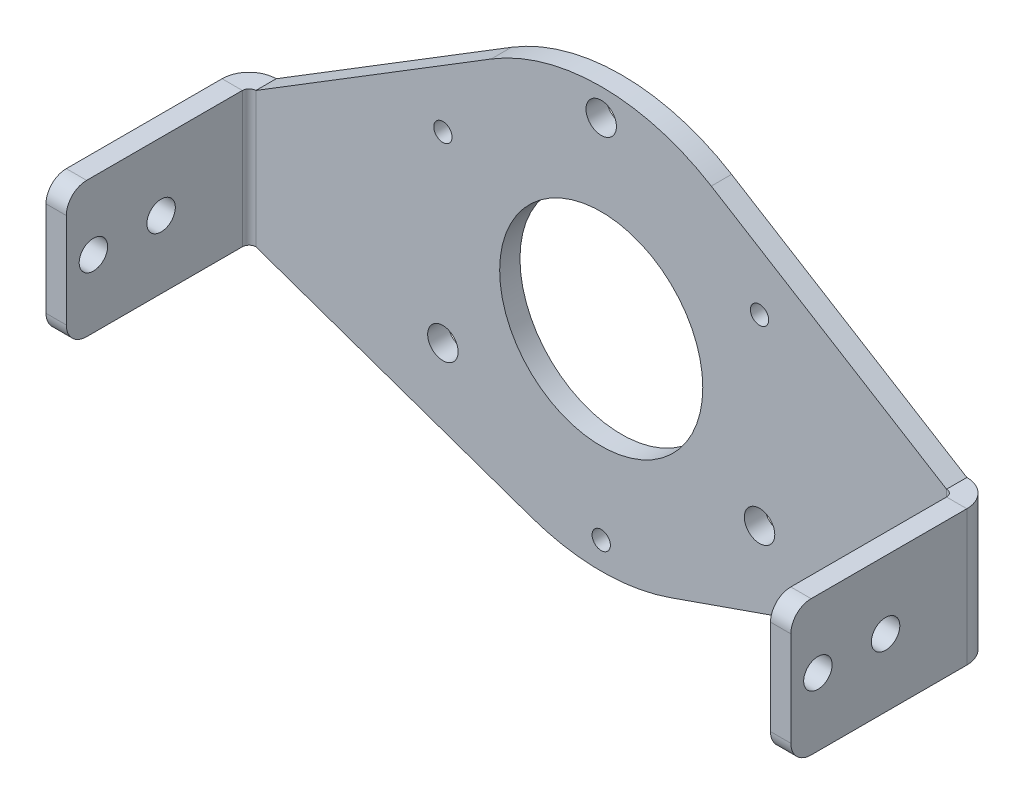
ISO-10303-21;
HEADER;
FILE_DESCRIPTION(('STEP AP214'),'2;1');
FILE_NAME('part.step','',(''),(''),'','','');
FILE_SCHEMA(('AUTOMOTIVE_DESIGN { 1 0 10303 214 1 1 1 1 }'));
ENDSEC;
DATA;
#1=APPLICATION_CONTEXT('core data for automotive mechanical design processes');
#2=APPLICATION_PROTOCOL_DEFINITION('international standard','automotive_design',2000,#1);
#3=PRODUCT_CONTEXT('',#1,'mechanical');
#4=PRODUCT('Part','Part','',(#3));
#5=PRODUCT_RELATED_PRODUCT_CATEGORY('part','',(#4));
#6=PRODUCT_DEFINITION_FORMATION('','',#4);
#7=PRODUCT_DEFINITION_CONTEXT('part definition',#1,'design');
#8=PRODUCT_DEFINITION('design','',#6,#7);
#9=PRODUCT_DEFINITION_SHAPE('','',#8);
#10=(LENGTH_UNIT() NAMED_UNIT(*) SI_UNIT(.MILLI.,.METRE.));
#11=(NAMED_UNIT(*) PLANE_ANGLE_UNIT() SI_UNIT($,.RADIAN.));
#12=(NAMED_UNIT(*) SI_UNIT($,.STERADIAN.) SOLID_ANGLE_UNIT());
#13=UNCERTAINTY_MEASURE_WITH_UNIT(LENGTH_MEASURE(1.E-05),#10,'distance_accuracy_value','');
#14=(GEOMETRIC_REPRESENTATION_CONTEXT(3) GLOBAL_UNCERTAINTY_ASSIGNED_CONTEXT((#13)) GLOBAL_UNIT_ASSIGNED_CONTEXT((#10,
#11,#12)) REPRESENTATION_CONTEXT('',''));
#15=CARTESIAN_POINT('',(0.,0.,0.));
#16=DIRECTION('',(0.,0.,1.));
#17=DIRECTION('',(1.,0.,0.));
#18=AXIS2_PLACEMENT_3D('',#15,#16,#17);
#19=CARTESIAN_POINT('',(16.2552613150944,26.3963345860366,3.));
#20=DIRECTION('',(-0.524363268228853,-0.851494664065698,0.));
#21=DIRECTION('',(0.851494664065698,-0.524363268228853,0.));
#22=AXIS2_PLACEMENT_3D('',#19,#20,#21);
#23=PLANE('',#22);
#24=DIRECTION('',(0.,0.,1.));
#25=VECTOR('',#24,1.);
#26=CARTESIAN_POINT('',(51.,5.,3.));
#27=LINE('',#26,#25);
#28=CARTESIAN_POINT('',(51.,5.,0.));
#29=VERTEX_POINT('',#28);
#30=CARTESIAN_POINT('',(51.,5.,3.00000000000001));
#31=VERTEX_POINT('',#30);
#32=EDGE_CURVE('E411',#29,#31,#27,.T.);
#33=ORIENTED_EDGE('',*,*,#32,.F.);
#34=DIRECTION('',(0.851494664065698,-0.524363268228853,0.));
#35=VECTOR('',#34,1.);
#36=CARTESIAN_POINT('',(16.2552613150944,26.3963345860366,0.));
#37=LINE('',#36,#35);
#38=CARTESIAN_POINT('',(16.2552613150945,26.3963345860366,0.));
#39=VERTEX_POINT('',#38);
#40=EDGE_CURVE('E387',#39,#29,#37,.T.);
#41=ORIENTED_EDGE('',*,*,#40,.F.);
#42=DIRECTION('',(0.,0.,1.));
#43=VECTOR('',#42,1.);
#44=CARTESIAN_POINT('',(16.2552613150945,26.3963345860366,3.));
#45=LINE('',#44,#43);
#46=CARTESIAN_POINT('',(16.2552613150945,26.3963345860366,3.));
#47=VERTEX_POINT('',#46);
#48=EDGE_CURVE('E409',#39,#47,#45,.T.);
#49=ORIENTED_EDGE('',*,*,#48,.T.);
#50=DIRECTION('',(0.851494664065698,-0.524363268228853,0.));
#51=VECTOR('',#50,1.);
#52=CARTESIAN_POINT('',(16.2552613150944,26.3963345860366,3.));
#53=LINE('',#52,#51);
#54=EDGE_CURVE('E341',#47,#31,#53,.T.);
#55=ORIENTED_EDGE('',*,*,#54,.T.);
#56=EDGE_LOOP('',(#33,#41,#49,#55));
#57=FACE_BOUND('',#56,.T.);
#58=ADVANCED_FACE('F83',(#57),#23,.F.);
#59=CARTESIAN_POINT('',(0.,0.,3.));
#60=DIRECTION('',(0.,0.,1.));
#61=DIRECTION('',(1.,0.,0.));
#62=AXIS2_PLACEMENT_3D('',#59,#60,#61);
#63=CYLINDRICAL_SURFACE('',#62,31.);
#64=ORIENTED_EDGE('',*,*,#48,.F.);
#65=CARTESIAN_POINT('',(0.,0.,0.));
#66=DIRECTION('',(0.,0.,1.));
#67=DIRECTION('',(1.,0.,0.));
#68=AXIS2_PLACEMENT_3D('',#65,#66,#67);
#69=CIRCLE('',#68,31.);
#70=CARTESIAN_POINT('',(-16.2552613150944,26.3963345860366,0.));
#71=VERTEX_POINT('',#70);
#72=EDGE_CURVE('E384',#39,#71,#69,.T.);
#73=ORIENTED_EDGE('',*,*,#72,.T.);
#74=DIRECTION('',(0.,0.,1.));
#75=VECTOR('',#74,1.);
#76=CARTESIAN_POINT('',(-16.2552613150944,26.3963345860366,3.));
#77=LINE('',#76,#75);
#78=CARTESIAN_POINT('',(-16.2552613150944,26.3963345860366,3.));
#79=VERTEX_POINT('',#78);
#80=EDGE_CURVE('E407',#71,#79,#77,.T.);
#81=ORIENTED_EDGE('',*,*,#80,.T.);
#82=CARTESIAN_POINT('',(0.,0.,3.));
#83=DIRECTION('',(0.,0.,1.));
#84=DIRECTION('',(1.,0.,0.));
#85=AXIS2_PLACEMENT_3D('',#82,#83,#84);
#86=CIRCLE('',#85,31.);
#87=EDGE_CURVE('E336',#47,#79,#86,.T.);
#88=ORIENTED_EDGE('',*,*,#87,.F.);
#89=EDGE_LOOP('',(#64,#73,#81,#88));
#90=FACE_BOUND('',#89,.T.);
#91=ADVANCED_FACE('F520',(#90),#63,.T.);
#92=CARTESIAN_POINT('',(-16.2552613150944,26.3963345860366,3.));
#93=DIRECTION('',(-0.524363268228853,0.851494664065698,0.));
#94=DIRECTION('',(-0.851494664065698,-0.524363268228853,0.));
#95=AXIS2_PLACEMENT_3D('',#92,#93,#94);
#96=PLANE('',#95);
#97=ORIENTED_EDGE('',*,*,#80,.F.);
#98=DIRECTION('',(-0.851494664065698,-0.524363268228853,0.));
#99=VECTOR('',#98,1.);
#100=CARTESIAN_POINT('',(-16.2552613150944,26.3963345860366,0.));
#101=LINE('',#100,#99);
#102=CARTESIAN_POINT('',(-51.,5.,0.));
#103=VERTEX_POINT('',#102);
#104=EDGE_CURVE('E381',#71,#103,#101,.T.);
#105=ORIENTED_EDGE('',*,*,#104,.T.);
#106=DIRECTION('',(0.,0.,1.));
#107=VECTOR('',#106,1.);
#108=CARTESIAN_POINT('',(-51.,5.,3.));
#109=LINE('',#108,#107);
#110=CARTESIAN_POINT('',(-51.,5.,3.));
#111=VERTEX_POINT('',#110);
#112=EDGE_CURVE('E405',#103,#111,#109,.T.);
#113=ORIENTED_EDGE('',*,*,#112,.T.);
#114=DIRECTION('',(-0.851494664065698,-0.524363268228853,0.));
#115=VECTOR('',#114,1.);
#116=CARTESIAN_POINT('',(-16.2552613150944,26.3963345860366,3.));
#117=LINE('',#116,#115);
#118=EDGE_CURVE('E344',#79,#111,#117,.T.);
#119=ORIENTED_EDGE('',*,*,#118,.F.);
#120=EDGE_LOOP('',(#97,#105,#113,#119));
#121=FACE_BOUND('',#120,.T.);
#122=ADVANCED_FACE('F522',(#121),#96,.T.);
#123=CARTESIAN_POINT('',(-10.2369691153677,-29.2609716744165,3.));
#124=DIRECTION('',(-0.330224810173151,-0.943902312077954,0.));
#125=DIRECTION('',(0.943902312077954,-0.330224810173151,0.));
#126=AXIS2_PLACEMENT_3D('',#123,#124,#125);
#127=PLANE('',#126);
#128=DIRECTION('',(0.,0.,1.));
#129=VECTOR('',#128,1.);
#130=CARTESIAN_POINT('',(-51.,-15.,3.));
#131=LINE('',#130,#129);
#132=CARTESIAN_POINT('',(-51.,-15.,0.));
#133=VERTEX_POINT('',#132);
#134=CARTESIAN_POINT('',(-51.,-15.,3.));
#135=VERTEX_POINT('',#134);
#136=EDGE_CURVE('E402',#133,#135,#131,.T.);
#137=ORIENTED_EDGE('',*,*,#136,.F.);
#138=DIRECTION('',(0.943902312077954,-0.330224810173151,0.));
#139=VECTOR('',#138,1.);
#140=CARTESIAN_POINT('',(-10.2369691153677,-29.2609716744165,0.));
#141=LINE('',#140,#139);
#142=CARTESIAN_POINT('',(-10.2369691153677,-29.2609716744166,0.));
#143=VERTEX_POINT('',#142);
#144=EDGE_CURVE('E374',#133,#143,#141,.T.);
#145=ORIENTED_EDGE('',*,*,#144,.T.);
#146=DIRECTION('',(0.,0.,1.));
#147=VECTOR('',#146,1.);
#148=CARTESIAN_POINT('',(-10.2369691153677,-29.2609716744166,3.));
#149=LINE('',#148,#147);
#150=CARTESIAN_POINT('',(-10.2369691153677,-29.2609716744166,3.));
#151=VERTEX_POINT('',#150);
#152=EDGE_CURVE('E400',#143,#151,#149,.T.);
#153=ORIENTED_EDGE('',*,*,#152,.T.);
#154=DIRECTION('',(0.943902312077954,-0.330224810173151,0.));
#155=VECTOR('',#154,1.);
#156=CARTESIAN_POINT('',(-10.2369691153677,-29.2609716744165,3.));
#157=LINE('',#156,#155);
#158=EDGE_CURVE('E349',#135,#151,#157,.T.);
#159=ORIENTED_EDGE('',*,*,#158,.F.);
#160=EDGE_LOOP('',(#137,#145,#153,#159));
#161=FACE_BOUND('',#160,.T.);
#162=ADVANCED_FACE('F493',(#161),#127,.T.);
#163=ORIENTED_EDGE('',*,*,#152,.F.);
#164=CARTESIAN_POINT('',(0.,0.,0.));
#165=DIRECTION('',(0.,0.,1.));
#166=DIRECTION('',(1.,0.,0.));
#167=AXIS2_PLACEMENT_3D('',#164,#165,#166);
#168=CIRCLE('',#167,31.);
#169=CARTESIAN_POINT('',(10.2369691153677,-29.2609716744166,0.));
#170=VERTEX_POINT('',#169);
#171=EDGE_CURVE('E370',#143,#170,#168,.T.);
#172=ORIENTED_EDGE('',*,*,#171,.T.);
#173=DIRECTION('',(0.,0.,1.));
#174=VECTOR('',#173,1.);
#175=CARTESIAN_POINT('',(10.2369691153677,-29.2609716744166,3.));
#176=LINE('',#175,#174);
#177=CARTESIAN_POINT('',(10.2369691153677,-29.2609716744166,3.));
#178=VERTEX_POINT('',#177);
#179=EDGE_CURVE('E361',#170,#178,#176,.T.);
#180=ORIENTED_EDGE('',*,*,#179,.T.);
#181=EDGE_CURVE('E332',#151,#178,#86,.T.);
#182=ORIENTED_EDGE('',*,*,#181,.F.);
#183=EDGE_LOOP('',(#163,#172,#180,#182));
#184=FACE_BOUND('',#183,.T.);
#185=ADVANCED_FACE('F497',(#184),#63,.T.);
#186=CARTESIAN_POINT('',(-23.3826859021798,-13.5,3.));
#187=DIRECTION('',(0.,0.,1.));
#188=DIRECTION('',(1.,0.,0.));
#189=AXIS2_PLACEMENT_3D('',#186,#187,#188);
#190=CYLINDRICAL_SURFACE('',#189,2.25);
#191=CARTESIAN_POINT('',(-23.3826859021798,-13.5,3.));
#192=DIRECTION('',(0.,0.,1.));
#193=DIRECTION('',(1.,0.,0.));
#194=AXIS2_PLACEMENT_3D('',#191,#192,#193);
#195=CIRCLE('',#194,2.25);
#196=CARTESIAN_POINT('',(-21.1326859021798,-13.5,3.));
#197=VERTEX_POINT('',#196);
#198=EDGE_CURVE('E322',#197,#197,#195,.T.);
#199=ORIENTED_EDGE('',*,*,#198,.T.);
#200=EDGE_LOOP('',(#199));
#201=FACE_BOUND('',#200,.T.);
#202=CARTESIAN_POINT('',(-23.3826859021798,-13.5,0.));
#203=DIRECTION('',(0.,0.,1.));
#204=DIRECTION('',(1.,0.,0.));
#205=AXIS2_PLACEMENT_3D('',#202,#203,#204);
#206=CIRCLE('',#205,2.25);
#207=CARTESIAN_POINT('',(-21.1326859021798,-13.5,0.));
#208=VERTEX_POINT('',#207);
#209=EDGE_CURVE('E319',#208,#208,#206,.T.);
#210=ORIENTED_EDGE('',*,*,#209,.F.);
#211=EDGE_LOOP('',(#210));
#212=FACE_BOUND('',#211,.T.);
#213=ADVANCED_FACE('F849',(#201,#212),#190,.F.);
#214=CARTESIAN_POINT('',(23.3826859021798,-13.5,3.));
#215=DIRECTION('',(0.,0.,1.));
#216=DIRECTION('',(1.,0.,0.));
#217=AXIS2_PLACEMENT_3D('',#214,#215,#216);
#218=CYLINDRICAL_SURFACE('',#217,2.25);
#219=CARTESIAN_POINT('',(23.3826859021798,-13.5,3.));
#220=DIRECTION('',(0.,0.,1.));
#221=DIRECTION('',(1.,0.,0.));
#222=AXIS2_PLACEMENT_3D('',#219,#220,#221);
#223=CIRCLE('',#222,2.25);
#224=CARTESIAN_POINT('',(25.6326859021799,-13.5,3.));
#225=VERTEX_POINT('',#224);
#226=EDGE_CURVE('E325',#225,#225,#223,.T.);
#227=ORIENTED_EDGE('',*,*,#226,.T.);
#228=EDGE_LOOP('',(#227));
#229=FACE_BOUND('',#228,.T.);
#230=CARTESIAN_POINT('',(23.3826859021798,-13.5,0.));
#231=DIRECTION('',(0.,0.,1.));
#232=DIRECTION('',(1.,0.,0.));
#233=AXIS2_PLACEMENT_3D('',#230,#231,#232);
#234=CIRCLE('',#233,2.25);
#235=CARTESIAN_POINT('',(25.6326859021799,-13.5,0.));
#236=VERTEX_POINT('',#235);
#237=EDGE_CURVE('E364',#236,#236,#234,.T.);
#238=ORIENTED_EDGE('',*,*,#237,.F.);
#239=EDGE_LOOP('',(#238));
#240=FACE_BOUND('',#239,.T.);
#241=ADVANCED_FACE('F836',(#229,#240),#218,.F.);
#242=CARTESIAN_POINT('',(0.,27.,3.));
#243=DIRECTION('',(0.,0.,1.));
#244=DIRECTION('',(1.,0.,0.));
#245=AXIS2_PLACEMENT_3D('',#242,#243,#244);
#246=CYLINDRICAL_SURFACE('',#245,2.25);
#247=CARTESIAN_POINT('',(0.,27.,3.));
#248=DIRECTION('',(0.,0.,1.));
#249=DIRECTION('',(1.,0.,0.));
#250=AXIS2_PLACEMENT_3D('',#247,#248,#249);
#251=CIRCLE('',#250,2.25);
#252=CARTESIAN_POINT('',(2.25,27.,3.));
#253=VERTEX_POINT('',#252);
#254=EDGE_CURVE('E329',#253,#253,#251,.T.);
#255=ORIENTED_EDGE('',*,*,#254,.T.);
#256=EDGE_LOOP('',(#255));
#257=FACE_BOUND('',#256,.T.);
#258=CARTESIAN_POINT('',(0.,27.,0.));
#259=DIRECTION('',(0.,0.,1.));
#260=DIRECTION('',(1.,0.,0.));
#261=AXIS2_PLACEMENT_3D('',#258,#259,#260);
#262=CIRCLE('',#261,2.25);
#263=CARTESIAN_POINT('',(2.25,27.,0.));
#264=VERTEX_POINT('',#263);
#265=EDGE_CURVE('E367',#264,#264,#262,.T.);
#266=ORIENTED_EDGE('',*,*,#265,.F.);
#267=EDGE_LOOP('',(#266));
#268=FACE_BOUND('',#267,.T.);
#269=ADVANCED_FACE('F540',(#257,#268),#246,.F.);
#270=CARTESIAN_POINT('',(10.2369691153677,-29.2609716744165,3.));
#271=DIRECTION('',(-0.330224810173151,0.943902312077954,0.));
#272=DIRECTION('',(-0.943902312077954,-0.330224810173151,0.));
#273=AXIS2_PLACEMENT_3D('',#270,#271,#272);
#274=PLANE('',#273);
#275=DIRECTION('',(-0.943902312077954,-0.330224810173151,0.));
#276=VECTOR('',#275,1.);
#277=CARTESIAN_POINT('',(10.2369691153677,-29.2609716744165,0.));
#278=LINE('',#277,#276);
#279=CARTESIAN_POINT('',(51.,-15.,0.));
#280=VERTEX_POINT('',#279);
#281=EDGE_CURVE('E373',#280,#170,#278,.T.);
#282=ORIENTED_EDGE('',*,*,#281,.F.);
#283=DIRECTION('',(0.,0.,1.));
#284=VECTOR('',#283,1.);
#285=CARTESIAN_POINT('',(51.,-15.,3.));
#286=LINE('',#285,#284);
#287=CARTESIAN_POINT('',(51.,-15.,3.00000000000001));
#288=VERTEX_POINT('',#287);
#289=EDGE_CURVE('E413',#280,#288,#286,.T.);
#290=ORIENTED_EDGE('',*,*,#289,.T.);
#291=DIRECTION('',(-0.943902312077954,-0.330224810173151,0.));
#292=VECTOR('',#291,1.);
#293=CARTESIAN_POINT('',(10.2369691153677,-29.2609716744165,3.));
#294=LINE('',#293,#292);
#295=EDGE_CURVE('E335',#288,#178,#294,.T.);
#296=ORIENTED_EDGE('',*,*,#295,.T.);
#297=ORIENTED_EDGE('',*,*,#179,.F.);
#298=EDGE_LOOP('',(#282,#290,#296,#297));
#299=FACE_BOUND('',#298,.T.);
#300=ADVANCED_FACE('F502',(#299),#274,.F.);
#301=CARTESIAN_POINT('',(0.,-27.,3.));
#302=DIRECTION('',(0.,0.,1.));
#303=DIRECTION('',(1.,0.,0.));
#304=AXIS2_PLACEMENT_3D('',#301,#302,#303);
#305=CYLINDRICAL_SURFACE('',#304,1.35);
#306=CARTESIAN_POINT('',(0.,-27.,3.));
#307=DIRECTION('',(0.,0.,1.));
#308=DIRECTION('',(1.,0.,0.));
#309=AXIS2_PLACEMENT_3D('',#306,#307,#308);
#310=CIRCLE('',#309,1.35);
#311=CARTESIAN_POINT('',(1.35,-27.,3.));
#312=VERTEX_POINT('',#311);
#313=EDGE_CURVE('E352',#312,#312,#310,.T.);
#314=ORIENTED_EDGE('',*,*,#313,.T.);
#315=EDGE_LOOP('',(#314));
#316=FACE_BOUND('',#315,.T.);
#317=CARTESIAN_POINT('',(0.,-27.,0.));
#318=DIRECTION('',(0.,0.,1.));
#319=DIRECTION('',(1.,0.,0.));
#320=AXIS2_PLACEMENT_3D('',#317,#318,#319);
#321=CIRCLE('',#320,1.35);
#322=CARTESIAN_POINT('',(1.35,-27.,0.));
#323=VERTEX_POINT('',#322);
#324=EDGE_CURVE('E377',#323,#323,#321,.T.);
#325=ORIENTED_EDGE('',*,*,#324,.F.);
#326=EDGE_LOOP('',(#325));
#327=FACE_BOUND('',#326,.T.);
#328=ADVANCED_FACE('F539',(#316,#327),#305,.F.);
#329=CARTESIAN_POINT('',(-23.3826859021798,13.5,3.));
#330=DIRECTION('',(0.,0.,1.));
#331=DIRECTION('',(1.,0.,0.));
#332=AXIS2_PLACEMENT_3D('',#329,#330,#331);
#333=CYLINDRICAL_SURFACE('',#332,1.35);
#334=CARTESIAN_POINT('',(-23.3826859021798,13.5,3.));
#335=DIRECTION('',(0.,0.,1.));
#336=DIRECTION('',(1.,0.,0.));
#337=AXIS2_PLACEMENT_3D('',#334,#335,#336);
#338=CIRCLE('',#337,1.35);
#339=CARTESIAN_POINT('',(-22.0326859021798,13.5,3.));
#340=VERTEX_POINT('',#339);
#341=EDGE_CURVE('E355',#340,#340,#338,.T.);
#342=ORIENTED_EDGE('',*,*,#341,.T.);
#343=EDGE_LOOP('',(#342));
#344=FACE_BOUND('',#343,.T.);
#345=CARTESIAN_POINT('',(-23.3826859021798,13.5,0.));
#346=DIRECTION('',(0.,0.,1.));
#347=DIRECTION('',(1.,0.,0.));
#348=AXIS2_PLACEMENT_3D('',#345,#346,#347);
#349=CIRCLE('',#348,1.35);
#350=CARTESIAN_POINT('',(-22.0326859021798,13.5,0.));
#351=VERTEX_POINT('',#350);
#352=EDGE_CURVE('E395',#351,#351,#349,.T.);
#353=ORIENTED_EDGE('',*,*,#352,.F.);
#354=EDGE_LOOP('',(#353));
#355=FACE_BOUND('',#354,.T.);
#356=ADVANCED_FACE('F543',(#344,#355),#333,.F.);
#357=CARTESIAN_POINT('',(23.3826859021798,13.5,3.));
#358=DIRECTION('',(0.,0.,1.));
#359=DIRECTION('',(1.,0.,0.));
#360=AXIS2_PLACEMENT_3D('',#357,#358,#359);
#361=CYLINDRICAL_SURFACE('',#360,1.35);
#362=CARTESIAN_POINT('',(23.3826859021798,13.5,3.));
#363=DIRECTION('',(0.,0.,1.));
#364=DIRECTION('',(1.,0.,0.));
#365=AXIS2_PLACEMENT_3D('',#362,#363,#364);
#366=CIRCLE('',#365,1.35);
#367=CARTESIAN_POINT('',(24.7326859021798,13.5,3.));
#368=VERTEX_POINT('',#367);
#369=EDGE_CURVE('E358',#368,#368,#366,.T.);
#370=ORIENTED_EDGE('',*,*,#369,.T.);
#371=EDGE_LOOP('',(#370));
#372=FACE_BOUND('',#371,.T.);
#373=CARTESIAN_POINT('',(23.3826859021798,13.5,0.));
#374=DIRECTION('',(0.,0.,1.));
#375=DIRECTION('',(1.,0.,0.));
#376=AXIS2_PLACEMENT_3D('',#373,#374,#375);
#377=CIRCLE('',#376,1.35);
#378=CARTESIAN_POINT('',(24.7326859021798,13.5,0.));
#379=VERTEX_POINT('',#378);
#380=EDGE_CURVE('E326',#379,#379,#377,.T.);
#381=ORIENTED_EDGE('',*,*,#380,.F.);
#382=EDGE_LOOP('',(#381));
#383=FACE_BOUND('',#382,.T.);
#384=ADVANCED_FACE('F547',(#372,#383),#361,.F.);
#385=CARTESIAN_POINT('',(0.,0.,3.));
#386=DIRECTION('',(0.,0.,1.));
#387=DIRECTION('',(1.,0.,0.));
#388=AXIS2_PLACEMENT_3D('',#385,#386,#387);
#389=PLANE('',#388);
#390=CARTESIAN_POINT('',(0.,0.,3.));
#391=DIRECTION('',(0.,0.,1.));
#392=DIRECTION('',(1.,0.,0.));
#393=AXIS2_PLACEMENT_3D('',#390,#391,#392);
#394=CIRCLE('',#393,15.);
#395=CARTESIAN_POINT('',(15.,0.,3.));
#396=VERTEX_POINT('',#395);
#397=EDGE_CURVE('E307',#396,#396,#394,.T.);
#398=ORIENTED_EDGE('',*,*,#397,.F.);
#399=EDGE_LOOP('',(#398));
#400=FACE_BOUND('',#399,.T.);
#401=ORIENTED_EDGE('',*,*,#198,.F.);
#402=EDGE_LOOP('',(#401));
#403=FACE_BOUND('',#402,.T.);
#404=ORIENTED_EDGE('',*,*,#226,.F.);
#405=EDGE_LOOP('',(#404));
#406=FACE_BOUND('',#405,.T.);
#407=ORIENTED_EDGE('',*,*,#254,.F.);
#408=EDGE_LOOP('',(#407));
#409=FACE_BOUND('',#408,.T.);
#410=ORIENTED_EDGE('',*,*,#181,.T.);
#411=ORIENTED_EDGE('',*,*,#295,.F.);
#412=DIRECTION('',(0.,-1.,0.));
#413=VECTOR('',#412,1.);
#414=CARTESIAN_POINT('',(51.,0.,3.));
#415=LINE('',#414,#413);
#416=EDGE_CURVE('E339',#31,#288,#415,.T.);
#417=ORIENTED_EDGE('',*,*,#416,.F.);
#418=ORIENTED_EDGE('',*,*,#54,.F.);
#419=ORIENTED_EDGE('',*,*,#87,.T.);
#420=ORIENTED_EDGE('',*,*,#118,.T.);
#421=DIRECTION('',(0.,-1.,0.));
#422=VECTOR('',#421,1.);
#423=CARTESIAN_POINT('',(-51.,0.,3.));
#424=LINE('',#423,#422);
#425=EDGE_CURVE('E347',#111,#135,#424,.T.);
#426=ORIENTED_EDGE('',*,*,#425,.T.);
#427=ORIENTED_EDGE('',*,*,#158,.T.);
#428=EDGE_LOOP('',(#410,#411,#417,#418,#419,#420,#426,#427));
#429=FACE_BOUND('',#428,.T.);
#430=ORIENTED_EDGE('',*,*,#313,.F.);
#431=EDGE_LOOP('',(#430));
#432=FACE_BOUND('',#431,.T.);
#433=ORIENTED_EDGE('',*,*,#341,.F.);
#434=EDGE_LOOP('',(#433));
#435=FACE_BOUND('',#434,.T.);
#436=ORIENTED_EDGE('',*,*,#369,.F.);
#437=EDGE_LOOP('',(#436));
#438=FACE_BOUND('',#437,.T.);
#439=ADVANCED_FACE('F487',(#400,#403,#406,#409,#429,#432,#435,#438),#389,.T.);
#440=CARTESIAN_POINT('',(0.,0.,0.));
#441=DIRECTION('',(0.,0.,1.));
#442=DIRECTION('',(1.,0.,0.));
#443=AXIS2_PLACEMENT_3D('',#440,#441,#442);
#444=PLANE('',#443);
#445=CARTESIAN_POINT('',(0.,0.,0.));
#446=DIRECTION('',(0.,0.,1.));
#447=DIRECTION('',(1.,0.,0.));
#448=AXIS2_PLACEMENT_3D('',#445,#446,#447);
#449=CIRCLE('',#448,15.);
#450=CARTESIAN_POINT('',(15.,0.,0.));
#451=VERTEX_POINT('',#450);
#452=EDGE_CURVE('E316',#451,#451,#449,.T.);
#453=ORIENTED_EDGE('',*,*,#452,.T.);
#454=EDGE_LOOP('',(#453));
#455=FACE_BOUND('',#454,.T.);
#456=ORIENTED_EDGE('',*,*,#209,.T.);
#457=EDGE_LOOP('',(#456));
#458=FACE_BOUND('',#457,.T.);
#459=ORIENTED_EDGE('',*,*,#237,.T.);
#460=EDGE_LOOP('',(#459));
#461=FACE_BOUND('',#460,.T.);
#462=ORIENTED_EDGE('',*,*,#265,.T.);
#463=EDGE_LOOP('',(#462));
#464=FACE_BOUND('',#463,.T.);
#465=ORIENTED_EDGE('',*,*,#171,.F.);
#466=ORIENTED_EDGE('',*,*,#144,.F.);
#467=DIRECTION('',(0.,1.,0.));
#468=VECTOR('',#467,1.);
#469=CARTESIAN_POINT('',(-51.,0.,0.));
#470=LINE('',#469,#468);
#471=EDGE_CURVE('E378',#103,#133,#470,.F.);
#472=ORIENTED_EDGE('',*,*,#471,.F.);
#473=ORIENTED_EDGE('',*,*,#104,.F.);
#474=ORIENTED_EDGE('',*,*,#72,.F.);
#475=ORIENTED_EDGE('',*,*,#40,.T.);
#476=DIRECTION('',(0.,1.,0.));
#477=VECTOR('',#476,1.);
#478=CARTESIAN_POINT('',(51.,0.,0.));
#479=LINE('',#478,#477);
#480=EDGE_CURVE('E244',#29,#280,#479,.F.);
#481=ORIENTED_EDGE('',*,*,#480,.T.);
#482=ORIENTED_EDGE('',*,*,#281,.T.);
#483=EDGE_LOOP('',(#465,#466,#472,#473,#474,#475,#481,#482));
#484=FACE_BOUND('',#483,.T.);
#485=ORIENTED_EDGE('',*,*,#324,.T.);
#486=EDGE_LOOP('',(#485));
#487=FACE_BOUND('',#486,.T.);
#488=ORIENTED_EDGE('',*,*,#352,.T.);
#489=EDGE_LOOP('',(#488));
#490=FACE_BOUND('',#489,.T.);
#491=ORIENTED_EDGE('',*,*,#380,.T.);
#492=EDGE_LOOP('',(#491));
#493=FACE_BOUND('',#492,.T.);
#494=ADVANCED_FACE('F508',(#455,#458,#461,#464,#484,#487,#490,#493),#444,.F.);
#495=CARTESIAN_POINT('',(0.,0.,0.));
#496=DIRECTION('',(0.,0.,1.));
#497=DIRECTION('',(1.,0.,0.));
#498=AXIS2_PLACEMENT_3D('',#495,#496,#497);
#499=CYLINDRICAL_SURFACE('',#498,15.);
#500=ORIENTED_EDGE('',*,*,#452,.F.);
#501=EDGE_LOOP('',(#500));
#502=FACE_BOUND('',#501,.T.);
#503=ORIENTED_EDGE('',*,*,#397,.T.);
#504=EDGE_LOOP('',(#503));
#505=FACE_BOUND('',#504,.T.);
#506=ADVANCED_FACE('F767',(#502,#505),#499,.F.);
#507=CARTESIAN_POINT('',(-51.,5.,4.));
#508=DIRECTION('',(0.,1.,0.));
#509=DIRECTION('',(0.,0.,1.));
#510=AXIS2_PLACEMENT_3D('',#507,#508,#509);
#511=PLANE('',#510);
#512=DIRECTION('',(-1.,0.,0.));
#513=VECTOR('',#512,1.);
#514=CARTESIAN_POINT('',(-55.,5.,3.99999999999999));
#515=LINE('',#514,#513);
#516=CARTESIAN_POINT('',(-52.,5.,4.));
#517=VERTEX_POINT('',#516);
#518=CARTESIAN_POINT('',(-55.,5.,3.99999999999999));
#519=VERTEX_POINT('',#518);
#520=EDGE_CURVE('E273',#517,#519,#515,.T.);
#521=ORIENTED_EDGE('',*,*,#520,.F.);
#522=CARTESIAN_POINT('',(-51.,5.,4.));
#523=DIRECTION('',(0.,-1.,0.));
#524=DIRECTION('',(0.,0.,-1.));
#525=AXIS2_PLACEMENT_3D('',#522,#523,#524);
#526=CIRCLE('',#525,1.);
#527=EDGE_CURVE('E311',#111,#517,#526,.F.);
#528=ORIENTED_EDGE('',*,*,#527,.F.);
#529=ORIENTED_EDGE('',*,*,#112,.F.);
#530=CARTESIAN_POINT('',(-51.,5.,4.));
#531=DIRECTION('',(0.,-1.,0.));
#532=DIRECTION('',(0.,0.,-1.));
#533=AXIS2_PLACEMENT_3D('',#530,#531,#532);
#534=CIRCLE('',#533,4.);
#535=EDGE_CURVE('E304',#103,#519,#534,.F.);
#536=ORIENTED_EDGE('',*,*,#535,.T.);
#537=EDGE_LOOP('',(#521,#528,#529,#536));
#538=FACE_BOUND('',#537,.T.);
#539=ADVANCED_FACE('F476',(#538),#511,.T.);
#540=CARTESIAN_POINT('',(-51.,-15.,4.));
#541=DIRECTION('',(0.,1.,0.));
#542=DIRECTION('',(0.,0.,1.));
#543=AXIS2_PLACEMENT_3D('',#540,#541,#542);
#544=PLANE('',#543);
#545=CARTESIAN_POINT('',(-51.,-15.,4.));
#546=DIRECTION('',(0.,-1.,0.));
#547=DIRECTION('',(0.,0.,-1.));
#548=AXIS2_PLACEMENT_3D('',#545,#546,#547);
#549=CIRCLE('',#548,1.);
#550=CARTESIAN_POINT('',(-52.,-15.,4.));
#551=VERTEX_POINT('',#550);
#552=EDGE_CURVE('E280',#551,#135,#549,.T.);
#553=ORIENTED_EDGE('',*,*,#552,.F.);
#554=DIRECTION('',(-1.,0.,0.));
#555=VECTOR('',#554,1.);
#556=CARTESIAN_POINT('',(-52.,-15.,4.));
#557=LINE('',#556,#555);
#558=CARTESIAN_POINT('',(-55.,-15.,3.99999999999999));
#559=VERTEX_POINT('',#558);
#560=EDGE_CURVE('E296',#551,#559,#557,.T.);
#561=ORIENTED_EDGE('',*,*,#560,.T.);
#562=CARTESIAN_POINT('',(-51.,-15.,4.));
#563=DIRECTION('',(0.,-1.,0.));
#564=DIRECTION('',(0.,0.,-1.));
#565=AXIS2_PLACEMENT_3D('',#562,#563,#564);
#566=CIRCLE('',#565,4.);
#567=EDGE_CURVE('E308',#559,#133,#566,.T.);
#568=ORIENTED_EDGE('',*,*,#567,.T.);
#569=ORIENTED_EDGE('',*,*,#136,.T.);
#570=EDGE_LOOP('',(#553,#561,#568,#569));
#571=FACE_BOUND('',#570,.T.);
#572=ADVANCED_FACE('F470',(#571),#544,.F.);
#573=CARTESIAN_POINT('',(-51.,-15.,4.));
#574=DIRECTION('',(0.,-1.,0.));
#575=DIRECTION('',(-1.,0.,0.));
#576=AXIS2_PLACEMENT_3D('',#573,#574,#575);
#577=CYLINDRICAL_SURFACE('',#576,4.);
#578=ORIENTED_EDGE('',*,*,#471,.T.);
#579=ORIENTED_EDGE('',*,*,#567,.F.);
#580=DIRECTION('',(0.,-1.,0.));
#581=VECTOR('',#580,1.);
#582=CARTESIAN_POINT('',(-55.,5.,3.99999999999999));
#583=LINE('',#582,#581);
#584=EDGE_CURVE('E294',#559,#519,#583,.F.);
#585=ORIENTED_EDGE('',*,*,#584,.T.);
#586=ORIENTED_EDGE('',*,*,#535,.F.);
#587=EDGE_LOOP('',(#578,#579,#585,#586));
#588=FACE_BOUND('',#587,.T.);
#589=ADVANCED_FACE('F473',(#588),#577,.T.);
#590=CARTESIAN_POINT('',(-51.,-15.,4.));
#591=DIRECTION('',(0.,-1.,0.));
#592=DIRECTION('',(-1.,0.,0.));
#593=AXIS2_PLACEMENT_3D('',#590,#591,#592);
#594=CYLINDRICAL_SURFACE('',#593,1.);
#595=ORIENTED_EDGE('',*,*,#425,.F.);
#596=ORIENTED_EDGE('',*,*,#527,.T.);
#597=DIRECTION('',(0.,-1.,0.));
#598=VECTOR('',#597,1.);
#599=CARTESIAN_POINT('',(-52.,5.,4.));
#600=LINE('',#599,#598);
#601=EDGE_CURVE('E299',#517,#551,#600,.T.);
#602=ORIENTED_EDGE('',*,*,#601,.T.);
#603=ORIENTED_EDGE('',*,*,#552,.T.);
#604=EDGE_LOOP('',(#595,#596,#602,#603));
#605=FACE_BOUND('',#604,.T.);
#606=ADVANCED_FACE('F484',(#605),#594,.F.);
#607=CARTESIAN_POINT('',(-55.,5.,2.99999999999999));
#608=DIRECTION('',(0.,1.,0.));
#609=DIRECTION('',(-1.,0.,0.));
#610=AXIS2_PLACEMENT_3D('',#607,#608,#609);
#611=PLANE('',#610);
#612=DIRECTION('',(0.,0.,-1.));
#613=VECTOR('',#612,1.);
#614=CARTESIAN_POINT('',(-55.,5.,2.99999999999999));
#615=LINE('',#614,#613);
#616=CARTESIAN_POINT('',(-55.0000000000001,5.,27.));
#617=VERTEX_POINT('',#616);
#618=EDGE_CURVE('E284',#519,#617,#615,.F.);
#619=ORIENTED_EDGE('',*,*,#618,.T.);
#620=DIRECTION('',(1.,0.,0.));
#621=VECTOR('',#620,1.);
#622=CARTESIAN_POINT('',(-55.0000000000001,5.,27.));
#623=LINE('',#622,#621);
#624=CARTESIAN_POINT('',(-52.0000000000001,5.,27.));
#625=VERTEX_POINT('',#624);
#626=EDGE_CURVE('E13',#617,#625,#623,.T.);
#627=ORIENTED_EDGE('',*,*,#626,.T.);
#628=DIRECTION('',(0.,0.,1.));
#629=VECTOR('',#628,1.);
#630=CARTESIAN_POINT('',(-52.,5.,-1.83655816891841E-13));
#631=LINE('',#630,#629);
#632=EDGE_CURVE('E291',#517,#625,#631,.T.);
#633=ORIENTED_EDGE('',*,*,#632,.F.);
#634=ORIENTED_EDGE('',*,*,#520,.T.);
#635=EDGE_LOOP('',(#619,#627,#633,#634));
#636=FACE_BOUND('',#635,.T.);
#637=ADVANCED_FACE('F480',(#636),#611,.T.);
#638=CARTESIAN_POINT('',(-55.0000000000001,-15.,30.));
#639=DIRECTION('',(0.,-1.,0.));
#640=DIRECTION('',(1.,0.,0.));
#641=AXIS2_PLACEMENT_3D('',#638,#639,#640);
#642=PLANE('',#641);
#643=DIRECTION('',(0.,0.,-1.));
#644=VECTOR('',#643,1.);
#645=CARTESIAN_POINT('',(-52.,-15.,-1.83495194347769E-13));
#646=LINE('',#645,#644);
#647=CARTESIAN_POINT('',(-52.0000000000001,-15.,27.));
#648=VERTEX_POINT('',#647);
#649=EDGE_CURVE('E286',#648,#551,#646,.T.);
#650=ORIENTED_EDGE('',*,*,#649,.F.);
#651=DIRECTION('',(1.,0.,0.));
#652=VECTOR('',#651,1.);
#653=CARTESIAN_POINT('',(-55.0000000000001,-15.,27.));
#654=LINE('',#653,#652);
#655=CARTESIAN_POINT('',(-55.0000000000001,-15.,27.));
#656=VERTEX_POINT('',#655);
#657=EDGE_CURVE('E106',#648,#656,#654,.F.);
#658=ORIENTED_EDGE('',*,*,#657,.T.);
#659=DIRECTION('',(0.,0.,1.));
#660=VECTOR('',#659,1.);
#661=CARTESIAN_POINT('',(-55.0000000000001,-15.,30.));
#662=LINE('',#661,#660);
#663=EDGE_CURVE('E278',#656,#559,#662,.F.);
#664=ORIENTED_EDGE('',*,*,#663,.T.);
#665=ORIENTED_EDGE('',*,*,#560,.F.);
#666=EDGE_LOOP('',(#650,#658,#664,#665));
#667=FACE_BOUND('',#666,.T.);
#668=ADVANCED_FACE('F466',(#667),#642,.T.);
#669=CARTESIAN_POINT('',(-55.,0.,-1.93969638364298E-13));
#670=DIRECTION('',(1.,0.,0.));
#671=DIRECTION('',(0.,0.,-1.));
#672=AXIS2_PLACEMENT_3D('',#669,#670,#671);
#673=PLANE('',#672);
#674=CARTESIAN_POINT('',(-55.0000000000001,-5.,16.0000000000001));
#675=DIRECTION('',(1.,0.,0.));
#676=DIRECTION('',(0.,0.,-1.));
#677=AXIS2_PLACEMENT_3D('',#674,#675,#676);
#678=CIRCLE('',#677,2.1);
#679=CARTESIAN_POINT('',(-55.0000000000002,-5.,13.9000000000001));
#680=VERTEX_POINT('',#679);
#681=EDGE_CURVE('E422',#680,#680,#678,.T.);
#682=ORIENTED_EDGE('',*,*,#681,.T.);
#683=EDGE_LOOP('',(#682));
#684=FACE_BOUND('',#683,.T.);
#685=CARTESIAN_POINT('',(-55.0000000000001,-5.,26.0000000000001));
#686=DIRECTION('',(1.,0.,0.));
#687=DIRECTION('',(0.,0.,-1.));
#688=AXIS2_PLACEMENT_3D('',#685,#686,#687);
#689=CIRCLE('',#688,2.1);
#690=CARTESIAN_POINT('',(-55.0000000000001,-5.,23.9000000000001));
#691=VERTEX_POINT('',#690);
#692=EDGE_CURVE('E935',#691,#691,#689,.T.);
#693=ORIENTED_EDGE('',*,*,#692,.T.);
#694=EDGE_LOOP('',(#693));
#695=FACE_BOUND('',#694,.T.);
#696=ORIENTED_EDGE('',*,*,#663,.F.);
#697=CARTESIAN_POINT('',(-55.0000000000001,-12.,27.));
#698=DIRECTION('',(1.,0.,0.));
#699=DIRECTION('',(0.,0.,-1.));
#700=AXIS2_PLACEMENT_3D('',#697,#698,#699);
#701=CIRCLE('',#700,3.);
#702=CARTESIAN_POINT('',(-55.0000000000001,-12.,30.));
#703=VERTEX_POINT('',#702);
#704=EDGE_CURVE('E91',#656,#703,#701,.F.);
#705=ORIENTED_EDGE('',*,*,#704,.T.);
#706=DIRECTION('',(0.,1.,0.));
#707=VECTOR('',#706,1.);
#708=CARTESIAN_POINT('',(-55.0000000000001,5.,30.));
#709=LINE('',#708,#707);
#710=CARTESIAN_POINT('',(-55.0000000000001,2.,30.));
#711=VERTEX_POINT('',#710);
#712=EDGE_CURVE('E281',#711,#703,#709,.F.);
#713=ORIENTED_EDGE('',*,*,#712,.F.);
#714=CARTESIAN_POINT('',(-55.0000000000001,2.,27.));
#715=DIRECTION('',(1.,0.,0.));
#716=DIRECTION('',(0.,0.,-1.));
#717=AXIS2_PLACEMENT_3D('',#714,#715,#716);
#718=CIRCLE('',#717,3.);
#719=EDGE_CURVE('E98',#711,#617,#718,.F.);
#720=ORIENTED_EDGE('',*,*,#719,.T.);
#721=ORIENTED_EDGE('',*,*,#618,.F.);
#722=ORIENTED_EDGE('',*,*,#584,.F.);
#723=EDGE_LOOP('',(#696,#705,#713,#720,#721,#722));
#724=FACE_BOUND('',#723,.T.);
#725=ADVANCED_FACE('F453',(#684,#695,#724),#673,.F.);
#726=CARTESIAN_POINT('',(-52.,0.,-1.83495194347769E-13));
#727=DIRECTION('',(1.,0.,0.));
#728=DIRECTION('',(0.,0.,-1.));
#729=AXIS2_PLACEMENT_3D('',#726,#727,#728);
#730=PLANE('',#729);
#731=CARTESIAN_POINT('',(-52.,-5.,16.0000000000001));
#732=DIRECTION('',(1.,0.,0.));
#733=DIRECTION('',(0.,0.,-1.));
#734=AXIS2_PLACEMENT_3D('',#731,#732,#733);
#735=CIRCLE('',#734,2.1);
#736=CARTESIAN_POINT('',(-52.,-5.,13.9000000000001));
#737=VERTEX_POINT('',#736);
#738=EDGE_CURVE('E272',#737,#737,#735,.T.);
#739=ORIENTED_EDGE('',*,*,#738,.F.);
#740=EDGE_LOOP('',(#739));
#741=FACE_BOUND('',#740,.T.);
#742=CARTESIAN_POINT('',(-52.0000000000001,-5.,26.0000000000001));
#743=DIRECTION('',(1.,0.,0.));
#744=DIRECTION('',(0.,0.,-1.));
#745=AXIS2_PLACEMENT_3D('',#742,#743,#744);
#746=CIRCLE('',#745,2.1);
#747=CARTESIAN_POINT('',(-52.0000000000001,-5.,23.9000000000001));
#748=VERTEX_POINT('',#747);
#749=EDGE_CURVE('E421',#748,#748,#746,.T.);
#750=ORIENTED_EDGE('',*,*,#749,.F.);
#751=EDGE_LOOP('',(#750));
#752=FACE_BOUND('',#751,.T.);
#753=DIRECTION('',(0.,-1.,0.));
#754=VECTOR('',#753,1.);
#755=CARTESIAN_POINT('',(-52.0000000000001,0.,30.));
#756=LINE('',#755,#754);
#757=CARTESIAN_POINT('',(-52.0000000000001,2.,30.));
#758=VERTEX_POINT('',#757);
#759=CARTESIAN_POINT('',(-52.0000000000001,-12.,30.));
#760=VERTEX_POINT('',#759);
#761=EDGE_CURVE('E288',#758,#760,#756,.T.);
#762=ORIENTED_EDGE('',*,*,#761,.T.);
#763=CARTESIAN_POINT('',(-52.0000000000001,-12.,27.));
#764=DIRECTION('',(1.,0.,0.));
#765=DIRECTION('',(0.,0.,-1.));
#766=AXIS2_PLACEMENT_3D('',#763,#764,#765);
#767=CIRCLE('',#766,3.);
#768=EDGE_CURVE('E449',#760,#648,#767,.T.);
#769=ORIENTED_EDGE('',*,*,#768,.T.);
#770=ORIENTED_EDGE('',*,*,#649,.T.);
#771=ORIENTED_EDGE('',*,*,#601,.F.);
#772=ORIENTED_EDGE('',*,*,#632,.T.);
#773=CARTESIAN_POINT('',(-52.0000000000001,2.,27.));
#774=DIRECTION('',(1.,0.,0.));
#775=DIRECTION('',(0.,0.,-1.));
#776=AXIS2_PLACEMENT_3D('',#773,#774,#775);
#777=CIRCLE('',#776,3.);
#778=EDGE_CURVE('E447',#625,#758,#777,.T.);
#779=ORIENTED_EDGE('',*,*,#778,.T.);
#780=EDGE_LOOP('',(#762,#769,#770,#771,#772,#779));
#781=FACE_BOUND('',#780,.T.);
#782=ADVANCED_FACE('F463',(#741,#752,#781),#730,.T.);
#783=CARTESIAN_POINT('',(-55.0000000000001,5.,30.));
#784=DIRECTION('',(0.,0.,1.));
#785=DIRECTION('',(1.,0.,0.));
#786=AXIS2_PLACEMENT_3D('',#783,#784,#785);
#787=PLANE('',#786);
#788=ORIENTED_EDGE('',*,*,#712,.T.);
#789=DIRECTION('',(1.,0.,0.));
#790=VECTOR('',#789,1.);
#791=CARTESIAN_POINT('',(-55.0000000000001,-12.,30.));
#792=LINE('',#791,#790);
#793=EDGE_CURVE('E444',#703,#760,#792,.T.);
#794=ORIENTED_EDGE('',*,*,#793,.T.);
#795=ORIENTED_EDGE('',*,*,#761,.F.);
#796=DIRECTION('',(1.,0.,0.));
#797=VECTOR('',#796,1.);
#798=CARTESIAN_POINT('',(-55.0000000000001,2.,30.));
#799=LINE('',#798,#797);
#800=EDGE_CURVE('E442',#758,#711,#799,.F.);
#801=ORIENTED_EDGE('',*,*,#800,.T.);
#802=EDGE_LOOP('',(#788,#794,#795,#801));
#803=FACE_BOUND('',#802,.T.);
#804=ADVANCED_FACE('F458',(#803),#787,.T.);
#805=CARTESIAN_POINT('',(51.,-15.,4.));
#806=DIRECTION('',(0.,-1.,0.));
#807=DIRECTION('',(0.,0.,-1.));
#808=AXIS2_PLACEMENT_3D('',#805,#806,#807);
#809=PLANE('',#808);
#810=DIRECTION('',(1.,0.,0.));
#811=VECTOR('',#810,1.);
#812=CARTESIAN_POINT('',(55.,-15.,3.99999999999999));
#813=LINE('',#812,#811);
#814=CARTESIAN_POINT('',(52.,-15.,4.));
#815=VERTEX_POINT('',#814);
#816=CARTESIAN_POINT('',(55.,-15.,3.99999999999999));
#817=VERTEX_POINT('',#816);
#818=EDGE_CURVE('E269',#815,#817,#813,.T.);
#819=ORIENTED_EDGE('',*,*,#818,.F.);
#820=CARTESIAN_POINT('',(51.,-15.,4.));
#821=DIRECTION('',(0.,1.,0.));
#822=DIRECTION('',(0.,0.,1.));
#823=AXIS2_PLACEMENT_3D('',#820,#821,#822);
#824=CIRCLE('',#823,0.999999999999994);
#825=EDGE_CURVE('E248',#288,#815,#824,.F.);
#826=ORIENTED_EDGE('',*,*,#825,.F.);
#827=ORIENTED_EDGE('',*,*,#289,.F.);
#828=CARTESIAN_POINT('',(51.,-15.,4.));
#829=DIRECTION('',(0.,1.,0.));
#830=DIRECTION('',(0.,0.,1.));
#831=AXIS2_PLACEMENT_3D('',#828,#829,#830);
#832=CIRCLE('',#831,3.99999999999999);
#833=EDGE_CURVE('E247',#280,#817,#832,.F.);
#834=ORIENTED_EDGE('',*,*,#833,.T.);
#835=EDGE_LOOP('',(#819,#826,#827,#834));
#836=FACE_BOUND('',#835,.T.);
#837=ADVANCED_FACE('F506',(#836),#809,.T.);
#838=CARTESIAN_POINT('',(51.,5.,4.));
#839=DIRECTION('',(0.,-1.,0.));
#840=DIRECTION('',(0.,0.,-1.));
#841=AXIS2_PLACEMENT_3D('',#838,#839,#840);
#842=PLANE('',#841);
#843=CARTESIAN_POINT('',(51.,5.,4.));
#844=DIRECTION('',(0.,1.,0.));
#845=DIRECTION('',(0.,0.,1.));
#846=AXIS2_PLACEMENT_3D('',#843,#844,#845);
#847=CIRCLE('',#846,0.999999999999994);
#848=CARTESIAN_POINT('',(52.,5.,4.));
#849=VERTEX_POINT('',#848);
#850=EDGE_CURVE('E234',#849,#31,#847,.T.);
#851=ORIENTED_EDGE('',*,*,#850,.F.);
#852=DIRECTION('',(1.,0.,0.));
#853=VECTOR('',#852,1.);
#854=CARTESIAN_POINT('',(52.,5.,4.));
#855=LINE('',#854,#853);
#856=CARTESIAN_POINT('',(55.,5.,3.99999999999999));
#857=VERTEX_POINT('',#856);
#858=EDGE_CURVE('E228',#849,#857,#855,.T.);
#859=ORIENTED_EDGE('',*,*,#858,.T.);
#860=CARTESIAN_POINT('',(51.,5.,4.));
#861=DIRECTION('',(0.,1.,0.));
#862=DIRECTION('',(0.,0.,1.));
#863=AXIS2_PLACEMENT_3D('',#860,#861,#862);
#864=CIRCLE('',#863,3.99999999999999);
#865=EDGE_CURVE('E239',#857,#29,#864,.T.);
#866=ORIENTED_EDGE('',*,*,#865,.T.);
#867=ORIENTED_EDGE('',*,*,#32,.T.);
#868=EDGE_LOOP('',(#851,#859,#866,#867));
#869=FACE_BOUND('',#868,.T.);
#870=ADVANCED_FACE('F251',(#869),#842,.F.);
#871=CARTESIAN_POINT('',(51.,5.,4.));
#872=DIRECTION('',(0.,1.,0.));
#873=DIRECTION('',(1.,0.,0.));
#874=AXIS2_PLACEMENT_3D('',#871,#872,#873);
#875=CYLINDRICAL_SURFACE('',#874,3.99999999999999);
#876=ORIENTED_EDGE('',*,*,#480,.F.);
#877=ORIENTED_EDGE('',*,*,#865,.F.);
#878=DIRECTION('',(0.,1.,0.));
#879=VECTOR('',#878,1.);
#880=CARTESIAN_POINT('',(55.,-15.,3.99999999999999));
#881=LINE('',#880,#879);
#882=EDGE_CURVE('E241',#857,#817,#881,.F.);
#883=ORIENTED_EDGE('',*,*,#882,.T.);
#884=ORIENTED_EDGE('',*,*,#833,.F.);
#885=EDGE_LOOP('',(#876,#877,#883,#884));
#886=FACE_BOUND('',#885,.T.);
#887=ADVANCED_FACE('F240',(#886),#875,.T.);
#888=CARTESIAN_POINT('',(51.,5.,4.));
#889=DIRECTION('',(0.,1.,0.));
#890=DIRECTION('',(1.,0.,0.));
#891=AXIS2_PLACEMENT_3D('',#888,#889,#890);
#892=CYLINDRICAL_SURFACE('',#891,0.999999999999994);
#893=ORIENTED_EDGE('',*,*,#416,.T.);
#894=ORIENTED_EDGE('',*,*,#825,.T.);
#895=DIRECTION('',(0.,1.,0.));
#896=VECTOR('',#895,1.);
#897=CARTESIAN_POINT('',(52.,-15.,4.));
#898=LINE('',#897,#896);
#899=EDGE_CURVE('E253',#815,#849,#898,.T.);
#900=ORIENTED_EDGE('',*,*,#899,.T.);
#901=ORIENTED_EDGE('',*,*,#850,.T.);
#902=EDGE_LOOP('',(#893,#894,#900,#901));
#903=FACE_BOUND('',#902,.T.);
#904=ADVANCED_FACE('F516',(#903),#892,.F.);
#905=CARTESIAN_POINT('',(55.,-15.,2.99999999999999));
#906=DIRECTION('',(0.,-1.,0.));
#907=DIRECTION('',(0.,0.,-1.));
#908=AXIS2_PLACEMENT_3D('',#905,#906,#907);
#909=PLANE('',#908);
#910=DIRECTION('',(0.,0.,-1.));
#911=VECTOR('',#910,1.);
#912=CARTESIAN_POINT('',(55.,-15.,2.99999999999999));
#913=LINE('',#912,#911);
#914=CARTESIAN_POINT('',(55.0000000000001,-15.,27.));
#915=VERTEX_POINT('',#914);
#916=EDGE_CURVE('E259',#817,#915,#913,.F.);
#917=ORIENTED_EDGE('',*,*,#916,.T.);
#918=DIRECTION('',(-1.,0.,0.));
#919=VECTOR('',#918,1.);
#920=CARTESIAN_POINT('',(55.0000000000001,-15.,27.));
#921=LINE('',#920,#919);
#922=CARTESIAN_POINT('',(52.0000000000001,-15.,27.));
#923=VERTEX_POINT('',#922);
#924=EDGE_CURVE('E416',#915,#923,#921,.T.);
#925=ORIENTED_EDGE('',*,*,#924,.T.);
#926=DIRECTION('',(0.,0.,1.));
#927=VECTOR('',#926,1.);
#928=CARTESIAN_POINT('',(52.,-15.,-1.83495194347769E-13));
#929=LINE('',#928,#927);
#930=EDGE_CURVE('E260',#815,#923,#929,.T.);
#931=ORIENTED_EDGE('',*,*,#930,.F.);
#932=ORIENTED_EDGE('',*,*,#818,.T.);
#933=EDGE_LOOP('',(#917,#925,#931,#932));
#934=FACE_BOUND('',#933,.T.);
#935=ADVANCED_FACE('F653',(#934),#909,.T.);
#936=CARTESIAN_POINT('',(55.0000000000001,5.,30.));
#937=DIRECTION('',(0.,1.,0.));
#938=DIRECTION('',(0.,0.,1.));
#939=AXIS2_PLACEMENT_3D('',#936,#937,#938);
#940=PLANE('',#939);
#941=DIRECTION('',(0.,0.,-1.));
#942=VECTOR('',#941,1.);
#943=CARTESIAN_POINT('',(52.,5.,-1.83495194347769E-13));
#944=LINE('',#943,#942);
#945=CARTESIAN_POINT('',(52.0000000000001,5.,27.));
#946=VERTEX_POINT('',#945);
#947=EDGE_CURVE('E953',#946,#849,#944,.T.);
#948=ORIENTED_EDGE('',*,*,#947,.F.);
#949=DIRECTION('',(-1.,0.,0.));
#950=VECTOR('',#949,1.);
#951=CARTESIAN_POINT('',(55.0000000000001,5.,27.));
#952=LINE('',#951,#950);
#953=CARTESIAN_POINT('',(55.0000000000001,5.,27.));
#954=VERTEX_POINT('',#953);
#955=EDGE_CURVE('E230',#946,#954,#952,.F.);
#956=ORIENTED_EDGE('',*,*,#955,.T.);
#957=DIRECTION('',(0.,0.,1.));
#958=VECTOR('',#957,1.);
#959=CARTESIAN_POINT('',(55.0000000000001,5.,30.));
#960=LINE('',#959,#958);
#961=EDGE_CURVE('E223',#954,#857,#960,.F.);
#962=ORIENTED_EDGE('',*,*,#961,.T.);
#963=ORIENTED_EDGE('',*,*,#858,.F.);
#964=EDGE_LOOP('',(#948,#956,#962,#963));
#965=FACE_BOUND('',#964,.T.);
#966=ADVANCED_FACE('F226',(#965),#940,.T.);
#967=CARTESIAN_POINT('',(55.,0.,-1.93969638364298E-13));
#968=DIRECTION('',(-1.,0.,0.));
#969=DIRECTION('',(0.,0.,1.));
#970=AXIS2_PLACEMENT_3D('',#967,#968,#969);
#971=PLANE('',#970);
#972=CARTESIAN_POINT('',(55.,-5.,15.9999999999997));
#973=DIRECTION('',(1.,0.,0.));
#974=DIRECTION('',(0.,0.,-1.));
#975=AXIS2_PLACEMENT_3D('',#972,#973,#974);
#976=CIRCLE('',#975,2.1);
#977=CARTESIAN_POINT('',(55.,-5.,13.8999999999997));
#978=VERTEX_POINT('',#977);
#979=EDGE_CURVE('E937',#978,#978,#976,.T.);
#980=ORIENTED_EDGE('',*,*,#979,.F.);
#981=EDGE_LOOP('',(#980));
#982=FACE_BOUND('',#981,.T.);
#983=CARTESIAN_POINT('',(55.0000000000001,-5.,25.9999999999997));
#984=DIRECTION('',(1.,0.,0.));
#985=DIRECTION('',(0.,0.,-1.));
#986=AXIS2_PLACEMENT_3D('',#983,#984,#985);
#987=CIRCLE('',#986,2.1);
#988=CARTESIAN_POINT('',(55.0000000000001,-5.,23.8999999999997));
#989=VERTEX_POINT('',#988);
#990=EDGE_CURVE('E938',#989,#989,#987,.T.);
#991=ORIENTED_EDGE('',*,*,#990,.F.);
#992=EDGE_LOOP('',(#991));
#993=FACE_BOUND('',#992,.T.);
#994=DIRECTION('',(0.,-1.,0.));
#995=VECTOR('',#994,1.);
#996=CARTESIAN_POINT('',(55.0000000000001,-15.,30.));
#997=LINE('',#996,#995);
#998=CARTESIAN_POINT('',(55.0000000000001,-12.,30.));
#999=VERTEX_POINT('',#998);
#1000=CARTESIAN_POINT('',(55.0000000000001,2.,30.));
#1001=VERTEX_POINT('',#1000);
#1002=EDGE_CURVE('E235',#999,#1001,#997,.F.);
#1003=ORIENTED_EDGE('',*,*,#1002,.F.);
#1004=CARTESIAN_POINT('',(55.0000000000001,-12.,27.));
#1005=DIRECTION('',(-1.,0.,0.));
#1006=DIRECTION('',(0.,0.,1.));
#1007=AXIS2_PLACEMENT_3D('',#1004,#1005,#1006);
#1008=CIRCLE('',#1007,3.);
#1009=EDGE_CURVE('E439',#999,#915,#1008,.F.);
#1010=ORIENTED_EDGE('',*,*,#1009,.T.);
#1011=ORIENTED_EDGE('',*,*,#916,.F.);
#1012=ORIENTED_EDGE('',*,*,#882,.F.);
#1013=ORIENTED_EDGE('',*,*,#961,.F.);
#1014=CARTESIAN_POINT('',(55.0000000000001,2.,27.));
#1015=DIRECTION('',(-1.,0.,0.));
#1016=DIRECTION('',(0.,0.,1.));
#1017=AXIS2_PLACEMENT_3D('',#1014,#1015,#1016);
#1018=CIRCLE('',#1017,3.);
#1019=EDGE_CURVE('E437',#954,#1001,#1018,.F.);
#1020=ORIENTED_EDGE('',*,*,#1019,.T.);
#1021=EDGE_LOOP('',(#1003,#1010,#1011,#1012,#1013,#1020));
#1022=FACE_BOUND('',#1021,.T.);
#1023=ADVANCED_FACE('F257',(#982,#993,#1022),#971,.F.);
#1024=CARTESIAN_POINT('',(52.,0.,-1.83495194347769E-13));
#1025=DIRECTION('',(-1.,0.,0.));
#1026=DIRECTION('',(0.,0.,1.));
#1027=AXIS2_PLACEMENT_3D('',#1024,#1025,#1026);
#1028=PLANE('',#1027);
#1029=CARTESIAN_POINT('',(52.,-5.,15.9999999999998));
#1030=DIRECTION('',(-1.,0.,0.));
#1031=DIRECTION('',(0.,0.,1.));
#1032=AXIS2_PLACEMENT_3D('',#1029,#1030,#1031);
#1033=CIRCLE('',#1032,2.1);
#1034=CARTESIAN_POINT('',(52.,-5.,18.0999999999998));
#1035=VERTEX_POINT('',#1034);
#1036=EDGE_CURVE('E423',#1035,#1035,#1033,.T.);
#1037=ORIENTED_EDGE('',*,*,#1036,.F.);
#1038=EDGE_LOOP('',(#1037));
#1039=FACE_BOUND('',#1038,.T.);
#1040=CARTESIAN_POINT('',(52.0000000000001,-5.,25.9999999999998));
#1041=DIRECTION('',(-1.,0.,0.));
#1042=DIRECTION('',(0.,0.,1.));
#1043=AXIS2_PLACEMENT_3D('',#1040,#1041,#1042);
#1044=CIRCLE('',#1043,2.1);
#1045=CARTESIAN_POINT('',(52.0000000000001,-5.,28.0999999999998));
#1046=VERTEX_POINT('',#1045);
#1047=EDGE_CURVE('E418',#1046,#1046,#1044,.T.);
#1048=ORIENTED_EDGE('',*,*,#1047,.F.);
#1049=EDGE_LOOP('',(#1048));
#1050=FACE_BOUND('',#1049,.T.);
#1051=ORIENTED_EDGE('',*,*,#930,.T.);
#1052=CARTESIAN_POINT('',(52.0000000000001,-12.,27.));
#1053=DIRECTION('',(-1.,0.,0.));
#1054=DIRECTION('',(0.,0.,1.));
#1055=AXIS2_PLACEMENT_3D('',#1052,#1053,#1054);
#1056=CIRCLE('',#1055,3.);
#1057=CARTESIAN_POINT('',(52.0000000000001,-12.,30.));
#1058=VERTEX_POINT('',#1057);
#1059=EDGE_CURVE('E430',#923,#1058,#1056,.T.);
#1060=ORIENTED_EDGE('',*,*,#1059,.T.);
#1061=DIRECTION('',(0.,1.,0.));
#1062=VECTOR('',#1061,1.);
#1063=CARTESIAN_POINT('',(52.0000000000001,0.,30.));
#1064=LINE('',#1063,#1062);
#1065=CARTESIAN_POINT('',(52.0000000000001,2.,30.));
#1066=VERTEX_POINT('',#1065);
#1067=EDGE_CURVE('E263',#1058,#1066,#1064,.T.);
#1068=ORIENTED_EDGE('',*,*,#1067,.T.);
#1069=CARTESIAN_POINT('',(52.0000000000001,2.,27.));
#1070=DIRECTION('',(-1.,0.,0.));
#1071=DIRECTION('',(0.,0.,1.));
#1072=AXIS2_PLACEMENT_3D('',#1069,#1070,#1071);
#1073=CIRCLE('',#1072,3.);
#1074=EDGE_CURVE('E428',#1066,#946,#1073,.T.);
#1075=ORIENTED_EDGE('',*,*,#1074,.T.);
#1076=ORIENTED_EDGE('',*,*,#947,.T.);
#1077=ORIENTED_EDGE('',*,*,#899,.F.);
#1078=EDGE_LOOP('',(#1051,#1060,#1068,#1075,#1076,#1077));
#1079=FACE_BOUND('',#1078,.T.);
#1080=ADVANCED_FACE('F625',(#1039,#1050,#1079),#1028,.T.);
#1081=CARTESIAN_POINT('',(55.0000000000001,-15.,30.));
#1082=DIRECTION('',(0.,0.,1.));
#1083=DIRECTION('',(1.,0.,0.));
#1084=AXIS2_PLACEMENT_3D('',#1081,#1082,#1083);
#1085=PLANE('',#1084);
#1086=ORIENTED_EDGE('',*,*,#1067,.F.);
#1087=DIRECTION('',(-1.,0.,0.));
#1088=VECTOR('',#1087,1.);
#1089=CARTESIAN_POINT('',(55.0000000000001,-12.,30.));
#1090=LINE('',#1089,#1088);
#1091=EDGE_CURVE('E435',#1058,#999,#1090,.F.);
#1092=ORIENTED_EDGE('',*,*,#1091,.T.);
#1093=ORIENTED_EDGE('',*,*,#1002,.T.);
#1094=DIRECTION('',(-1.,0.,0.));
#1095=VECTOR('',#1094,1.);
#1096=CARTESIAN_POINT('',(55.0000000000001,2.,30.));
#1097=LINE('',#1096,#1095);
#1098=EDGE_CURVE('E432',#1001,#1066,#1097,.T.);
#1099=ORIENTED_EDGE('',*,*,#1098,.T.);
#1100=EDGE_LOOP('',(#1086,#1092,#1093,#1099));
#1101=FACE_BOUND('',#1100,.T.);
#1102=ADVANCED_FACE('F616',(#1101),#1085,.T.);
#1103=CARTESIAN_POINT('',(-55.0000000000001,-5.,26.0000000000001));
#1104=DIRECTION('',(1.,0.,0.));
#1105=DIRECTION('',(0.,0.,-1.));
#1106=AXIS2_PLACEMENT_3D('',#1103,#1104,#1105);
#1107=CYLINDRICAL_SURFACE('',#1106,2.1);
#1108=ORIENTED_EDGE('',*,*,#1047,.T.);
#1109=EDGE_LOOP('',(#1108));
#1110=FACE_BOUND('',#1109,.T.);
#1111=ORIENTED_EDGE('',*,*,#990,.T.);
#1112=EDGE_LOOP('',(#1111));
#1113=FACE_BOUND('',#1112,.T.);
#1114=ADVANCED_FACE('F600',(#1110,#1113),#1107,.F.);
#1115=CARTESIAN_POINT('',(-55.0000000000001,-5.,16.0000000000001));
#1116=DIRECTION('',(1.,0.,0.));
#1117=DIRECTION('',(0.,0.,-1.));
#1118=AXIS2_PLACEMENT_3D('',#1115,#1116,#1117);
#1119=CYLINDRICAL_SURFACE('',#1118,2.1);
#1120=ORIENTED_EDGE('',*,*,#1036,.T.);
#1121=EDGE_LOOP('',(#1120));
#1122=FACE_BOUND('',#1121,.T.);
#1123=ORIENTED_EDGE('',*,*,#979,.T.);
#1124=EDGE_LOOP('',(#1123));
#1125=FACE_BOUND('',#1124,.T.);
#1126=ADVANCED_FACE('F589',(#1122,#1125),#1119,.F.);
#1127=ORIENTED_EDGE('',*,*,#749,.T.);
#1128=EDGE_LOOP('',(#1127));
#1129=FACE_BOUND('',#1128,.T.);
#1130=ORIENTED_EDGE('',*,*,#692,.F.);
#1131=EDGE_LOOP('',(#1130));
#1132=FACE_BOUND('',#1131,.T.);
#1133=ADVANCED_FACE('F586',(#1129,#1132),#1107,.F.);
#1134=ORIENTED_EDGE('',*,*,#738,.T.);
#1135=EDGE_LOOP('',(#1134));
#1136=FACE_BOUND('',#1135,.T.);
#1137=ORIENTED_EDGE('',*,*,#681,.F.);
#1138=EDGE_LOOP('',(#1137));
#1139=FACE_BOUND('',#1138,.T.);
#1140=ADVANCED_FACE('F556',(#1136,#1139),#1119,.F.);
#1141=CARTESIAN_POINT('',(55.0000000000001,-12.,27.));
#1142=DIRECTION('',(-1.,0.,0.));
#1143=DIRECTION('',(0.,0.,1.));
#1144=AXIS2_PLACEMENT_3D('',#1141,#1142,#1143);
#1145=CYLINDRICAL_SURFACE('',#1144,3.);
#1146=ORIENTED_EDGE('',*,*,#1009,.F.);
#1147=ORIENTED_EDGE('',*,*,#1091,.F.);
#1148=ORIENTED_EDGE('',*,*,#1059,.F.);
#1149=ORIENTED_EDGE('',*,*,#924,.F.);
#1150=EDGE_LOOP('',(#1146,#1147,#1148,#1149));
#1151=FACE_BOUND('',#1150,.T.);
#1152=ADVANCED_FACE('F552',(#1151),#1145,.T.);
#1153=CARTESIAN_POINT('',(55.0000000000001,2.,27.));
#1154=DIRECTION('',(-1.,0.,0.));
#1155=DIRECTION('',(0.,0.,1.));
#1156=AXIS2_PLACEMENT_3D('',#1153,#1154,#1155);
#1157=CYLINDRICAL_SURFACE('',#1156,3.);
#1158=ORIENTED_EDGE('',*,*,#1019,.F.);
#1159=ORIENTED_EDGE('',*,*,#955,.F.);
#1160=ORIENTED_EDGE('',*,*,#1074,.F.);
#1161=ORIENTED_EDGE('',*,*,#1098,.F.);
#1162=EDGE_LOOP('',(#1158,#1159,#1160,#1161));
#1163=FACE_BOUND('',#1162,.T.);
#1164=ADVANCED_FACE('F555',(#1163),#1157,.T.);
#1165=CARTESIAN_POINT('',(-55.0000000000001,-12.,27.));
#1166=DIRECTION('',(1.,0.,0.));
#1167=DIRECTION('',(0.,0.,-1.));
#1168=AXIS2_PLACEMENT_3D('',#1165,#1166,#1167);
#1169=CYLINDRICAL_SURFACE('',#1168,3.);
#1170=ORIENTED_EDGE('',*,*,#704,.F.);
#1171=ORIENTED_EDGE('',*,*,#657,.F.);
#1172=ORIENTED_EDGE('',*,*,#768,.F.);
#1173=ORIENTED_EDGE('',*,*,#793,.F.);
#1174=EDGE_LOOP('',(#1170,#1171,#1172,#1173));
#1175=FACE_BOUND('',#1174,.T.);
#1176=ADVANCED_FACE('F461',(#1175),#1169,.T.);
#1177=CARTESIAN_POINT('',(-55.0000000000001,2.,27.));
#1178=DIRECTION('',(1.,0.,0.));
#1179=DIRECTION('',(0.,0.,-1.));
#1180=AXIS2_PLACEMENT_3D('',#1177,#1178,#1179);
#1181=CYLINDRICAL_SURFACE('',#1180,3.);
#1182=ORIENTED_EDGE('',*,*,#719,.F.);
#1183=ORIENTED_EDGE('',*,*,#800,.F.);
#1184=ORIENTED_EDGE('',*,*,#778,.F.);
#1185=ORIENTED_EDGE('',*,*,#626,.F.);
#1186=EDGE_LOOP('',(#1182,#1183,#1184,#1185));
#1187=FACE_BOUND('',#1186,.T.);
#1188=ADVANCED_FACE('F85',(#1187),#1181,.T.);
#1189=CLOSED_SHELL('',(#58,#91,#122,#162,#185,#213,#241,#269,#300,#328,#356,#384,#439,#494,#506,
#539,#572,#589,#606,#637,#668,#725,#782,#804,#837,#870,#887,#904,#935,#966,#1023,#1080,#1102,
#1114,#1126,#1133,#1140,#1152,#1164,#1176,#1188));
#1190=MANIFOLD_SOLID_BREP('B2',#1189);
#1191=ADVANCED_BREP_SHAPE_REPRESENTATION('',(#18,#1190),#14);
#1192=SHAPE_DEFINITION_REPRESENTATION(#9,#1191);
ENDSEC;
END-ISO-10303-21;
